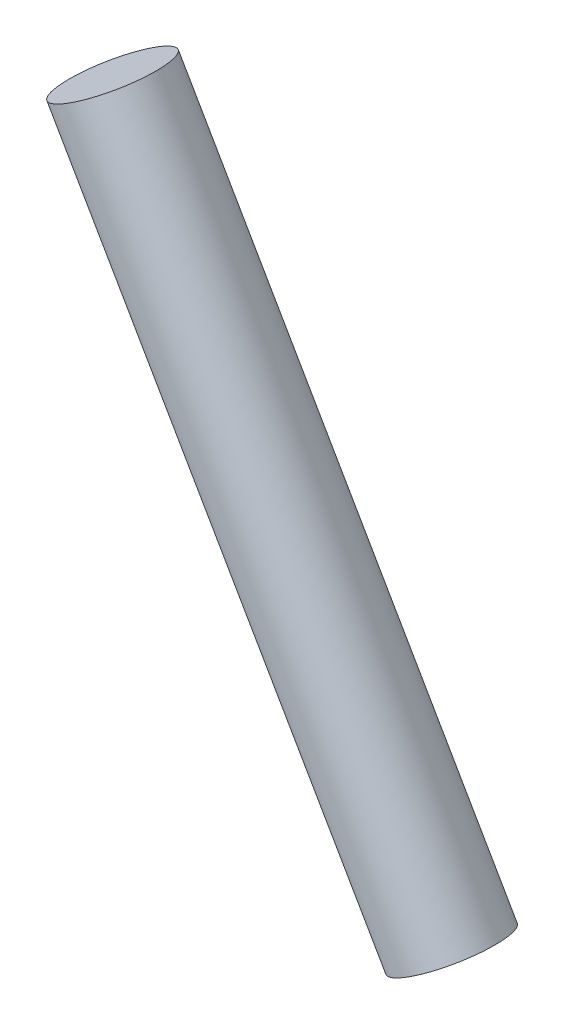
ISO-10303-21;
HEADER;
FILE_DESCRIPTION(('STEP AP214'),'2;1');
FILE_NAME('part.step','',(''),(''),'','','');
FILE_SCHEMA(('AUTOMOTIVE_DESIGN { 1 0 10303 214 1 1 1 1 }'));
ENDSEC;
DATA;
#1=APPLICATION_CONTEXT('core data for automotive mechanical design processes');
#2=APPLICATION_PROTOCOL_DEFINITION('international standard','automotive_design',2000,#1);
#3=PRODUCT_CONTEXT('',#1,'mechanical');
#4=PRODUCT('Part','Part','',(#3));
#5=PRODUCT_RELATED_PRODUCT_CATEGORY('part','',(#4));
#6=PRODUCT_DEFINITION_FORMATION('','',#4);
#7=PRODUCT_DEFINITION_CONTEXT('part definition',#1,'design');
#8=PRODUCT_DEFINITION('design','',#6,#7);
#9=PRODUCT_DEFINITION_SHAPE('','',#8);
#10=(LENGTH_UNIT() NAMED_UNIT(*) SI_UNIT(.MILLI.,.METRE.));
#11=(NAMED_UNIT(*) PLANE_ANGLE_UNIT() SI_UNIT($,.RADIAN.));
#12=(NAMED_UNIT(*) SI_UNIT($,.STERADIAN.) SOLID_ANGLE_UNIT());
#13=UNCERTAINTY_MEASURE_WITH_UNIT(LENGTH_MEASURE(1.E-05),#10,'distance_accuracy_value','');
#14=(GEOMETRIC_REPRESENTATION_CONTEXT(3) GLOBAL_UNCERTAINTY_ASSIGNED_CONTEXT((#13)) GLOBAL_UNIT_ASSIGNED_CONTEXT((#10,
#11,#12)) REPRESENTATION_CONTEXT('',''));
#15=CARTESIAN_POINT('',(0.,0.,0.));
#16=DIRECTION('',(0.,0.,1.));
#17=DIRECTION('',(1.,0.,0.));
#18=AXIS2_PLACEMENT_3D('',#15,#16,#17);
#19=CARTESIAN_POINT('',(219.900820084734,806.067862802885,-362.357302301473));
#20=DIRECTION('',(-0.499999999999996,0.866025403784441,0.));
#21=DIRECTION('',(-0.866025403784441,-0.499999999999996,0.));
#22=AXIS2_PLACEMENT_3D('',#19,#20,#21);
#23=PLANE('',#22);
#24=CARTESIAN_POINT('',(219.900820084734,806.067862802885,-362.357302301473));
#25=DIRECTION('',(-0.499999999999996,0.866025403784441,0.));
#26=DIRECTION('',(-0.866025403784441,-0.499999999999996,0.));
#27=AXIS2_PLACEMENT_3D('',#24,#25,#26);
#28=CIRCLE('',#27,1.5);
#29=CARTESIAN_POINT('',(218.601781979057,805.317862802885,-362.357302301473));
#30=VERTEX_POINT('',#29);
#31=EDGE_CURVE('E18',#30,#30,#28,.F.);
#32=ORIENTED_EDGE('',*,*,#31,.F.);
#33=EDGE_LOOP('',(#32));
#34=FACE_BOUND('',#33,.T.);
#35=ADVANCED_FACE('F15',(#34),#23,.T.);
#36=CARTESIAN_POINT('',(230.099181005442,788.403783534294,-362.357302301474));
#37=DIRECTION('',(0.499999999999996,-0.866025403784441,0.));
#38=DIRECTION('',(0.866025403784441,0.499999999999996,0.));
#39=AXIS2_PLACEMENT_3D('',#36,#37,#38);
#40=PLANE('',#39);
#41=CARTESIAN_POINT('',(230.099181005442,788.403783534294,-362.357302301473));
#42=DIRECTION('',(-0.499999999999996,0.866025403784441,0.));
#43=DIRECTION('',(-0.866025403784441,-0.499999999999996,0.));
#44=AXIS2_PLACEMENT_3D('',#41,#42,#43);
#45=CIRCLE('',#44,1.5);
#46=CARTESIAN_POINT('',(228.800142899765,787.653783534294,-362.357302301473));
#47=VERTEX_POINT('',#46);
#48=EDGE_CURVE('E10',#47,#47,#45,.T.);
#49=ORIENTED_EDGE('',*,*,#48,.F.);
#50=EDGE_LOOP('',(#49));
#51=FACE_BOUND('',#50,.T.);
#52=ADVANCED_FACE('F30',(#51),#40,.T.);
#53=CARTESIAN_POINT('',(225.000000545088,797.23582316859,-362.357302301473));
#54=DIRECTION('',(-0.499999999999996,0.866025403784441,0.));
#55=DIRECTION('',(-0.866025403784441,-0.499999999999996,0.));
#56=AXIS2_PLACEMENT_3D('',#53,#54,#55);
#57=CYLINDRICAL_SURFACE('',#56,1.5);
#58=ORIENTED_EDGE('',*,*,#31,.T.);
#59=EDGE_LOOP('',(#58));
#60=FACE_BOUND('',#59,.T.);
#61=ORIENTED_EDGE('',*,*,#48,.T.);
#62=EDGE_LOOP('',(#61));
#63=FACE_BOUND('',#62,.T.);
#64=ADVANCED_FACE('F27',(#60,#63),#57,.T.);
#65=CLOSED_SHELL('',(#35,#52,#64));
#66=MANIFOLD_SOLID_BREP('B1',#65);
#67=ADVANCED_BREP_SHAPE_REPRESENTATION('',(#18,#66),#14);
#68=SHAPE_DEFINITION_REPRESENTATION(#9,#67);
ENDSEC;
END-ISO-10303-21;
